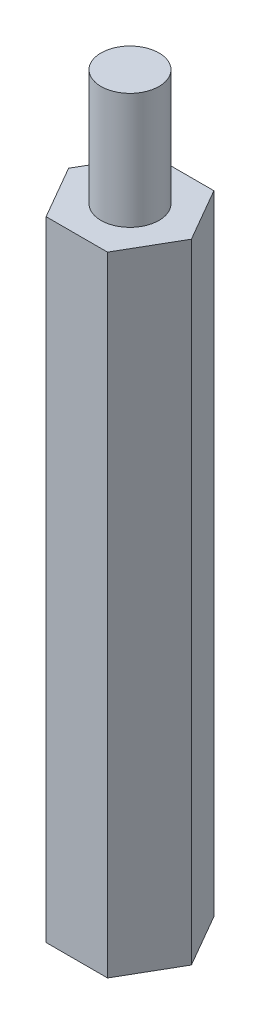
ISO-10303-21;
HEADER;
FILE_DESCRIPTION(('STEP AP214'),'2;1');
FILE_NAME('part.step','',(''),(''),'','','');
FILE_SCHEMA(('AUTOMOTIVE_DESIGN { 1 0 10303 214 1 1 1 1 }'));
ENDSEC;
DATA;
#1=APPLICATION_CONTEXT('core data for automotive mechanical design processes');
#2=APPLICATION_PROTOCOL_DEFINITION('international standard','automotive_design',2000,#1);
#3=PRODUCT_CONTEXT('',#1,'mechanical');
#4=PRODUCT('Part','Part','',(#3));
#5=PRODUCT_RELATED_PRODUCT_CATEGORY('part','',(#4));
#6=PRODUCT_DEFINITION_FORMATION('','',#4);
#7=PRODUCT_DEFINITION_CONTEXT('part definition',#1,'design');
#8=PRODUCT_DEFINITION('design','',#6,#7);
#9=PRODUCT_DEFINITION_SHAPE('','',#8);
#10=(LENGTH_UNIT() NAMED_UNIT(*) SI_UNIT(.MILLI.,.METRE.));
#11=(NAMED_UNIT(*) PLANE_ANGLE_UNIT() SI_UNIT($,.RADIAN.));
#12=(NAMED_UNIT(*) SI_UNIT($,.STERADIAN.) SOLID_ANGLE_UNIT());
#13=UNCERTAINTY_MEASURE_WITH_UNIT(LENGTH_MEASURE(1.E-05),#10,'distance_accuracy_value','');
#14=(GEOMETRIC_REPRESENTATION_CONTEXT(3) GLOBAL_UNCERTAINTY_ASSIGNED_CONTEXT((#13)) GLOBAL_UNIT_ASSIGNED_CONTEXT((#10,
#11,#12)) REPRESENTATION_CONTEXT('',''));
#15=CARTESIAN_POINT('',(0.,0.,0.));
#16=DIRECTION('',(0.,0.,1.));
#17=DIRECTION('',(1.,0.,0.));
#18=AXIS2_PLACEMENT_3D('',#15,#16,#17);
#19=CARTESIAN_POINT('',(-1.58771324027147,32.5,2.75));
#20=DIRECTION('',(0.,0.,-1.));
#21=DIRECTION('',(-1.,0.,0.));
#22=AXIS2_PLACEMENT_3D('',#19,#20,#21);
#23=PLANE('',#22);
#24=DIRECTION('',(1.,0.,0.));
#25=VECTOR('',#24,1.);
#26=CARTESIAN_POINT('',(-1.58771324027147,0.,2.75));
#27=LINE('',#26,#25);
#28=CARTESIAN_POINT('',(-1.58771324027147,0.,2.75));
#29=VERTEX_POINT('',#28);
#30=CARTESIAN_POINT('',(1.58771324027147,0.,2.75));
#31=VERTEX_POINT('',#30);
#32=EDGE_CURVE('E130',#29,#31,#27,.T.);
#33=ORIENTED_EDGE('',*,*,#32,.T.);
#34=DIRECTION('',(0.,-1.,0.));
#35=VECTOR('',#34,1.);
#36=CARTESIAN_POINT('',(1.58771324027147,32.5,2.75));
#37=LINE('',#36,#35);
#38=CARTESIAN_POINT('',(1.58771324027147,32.5,2.75));
#39=VERTEX_POINT('',#38);
#40=EDGE_CURVE('E42',#39,#31,#37,.T.);
#41=ORIENTED_EDGE('',*,*,#40,.F.);
#42=DIRECTION('',(1.,0.,0.));
#43=VECTOR('',#42,1.);
#44=CARTESIAN_POINT('',(-1.58771324027147,32.5,2.75));
#45=LINE('',#44,#43);
#46=CARTESIAN_POINT('',(-1.58771324027147,32.5,2.75));
#47=VERTEX_POINT('',#46);
#48=EDGE_CURVE('E147',#47,#39,#45,.T.);
#49=ORIENTED_EDGE('',*,*,#48,.F.);
#50=DIRECTION('',(0.,-1.,0.));
#51=VECTOR('',#50,1.);
#52=CARTESIAN_POINT('',(-1.58771324027147,32.5,2.75));
#53=LINE('',#52,#51);
#54=EDGE_CURVE('E126',#47,#29,#53,.T.);
#55=ORIENTED_EDGE('',*,*,#54,.T.);
#56=EDGE_LOOP('',(#33,#41,#49,#55));
#57=FACE_BOUND('',#56,.T.);
#58=ADVANCED_FACE('F39',(#57),#23,.F.);
#59=CARTESIAN_POINT('',(1.58771324027147,32.5,2.75));
#60=DIRECTION('',(-0.866025403784439,0.,-0.5));
#61=DIRECTION('',(-0.5,0.,0.866025403784439));
#62=AXIS2_PLACEMENT_3D('',#59,#60,#61);
#63=PLANE('',#62);
#64=DIRECTION('',(0.5,0.,-0.866025403784439));
#65=VECTOR('',#64,1.);
#66=CARTESIAN_POINT('',(1.58771324027147,0.,2.75));
#67=LINE('',#66,#65);
#68=CARTESIAN_POINT('',(3.17542648054294,0.,0.));
#69=VERTEX_POINT('',#68);
#70=EDGE_CURVE('E134',#31,#69,#67,.T.);
#71=ORIENTED_EDGE('',*,*,#70,.T.);
#72=DIRECTION('',(0.,-1.,0.));
#73=VECTOR('',#72,1.);
#74=CARTESIAN_POINT('',(3.17542648054294,32.5,0.));
#75=LINE('',#74,#73);
#76=CARTESIAN_POINT('',(3.17542648054294,32.5,0.));
#77=VERTEX_POINT('',#76);
#78=EDGE_CURVE('E153',#77,#69,#75,.T.);
#79=ORIENTED_EDGE('',*,*,#78,.F.);
#80=DIRECTION('',(0.5,0.,-0.866025403784439));
#81=VECTOR('',#80,1.);
#82=CARTESIAN_POINT('',(1.58771324027147,32.5,2.75));
#83=LINE('',#82,#81);
#84=EDGE_CURVE('E95',#39,#77,#83,.T.);
#85=ORIENTED_EDGE('',*,*,#84,.F.);
#86=ORIENTED_EDGE('',*,*,#40,.T.);
#87=EDGE_LOOP('',(#71,#79,#85,#86));
#88=FACE_BOUND('',#87,.T.);
#89=ADVANCED_FACE('F160',(#88),#63,.F.);
#90=CARTESIAN_POINT('',(3.17542648054294,32.5,0.));
#91=DIRECTION('',(-0.866025403784438,0.,0.5));
#92=DIRECTION('',(0.5,0.,0.866025403784438));
#93=AXIS2_PLACEMENT_3D('',#90,#91,#92);
#94=PLANE('',#93);
#95=DIRECTION('',(-0.5,0.,-0.866025403784438));
#96=VECTOR('',#95,1.);
#97=CARTESIAN_POINT('',(3.17542648054294,0.,0.));
#98=LINE('',#97,#96);
#99=CARTESIAN_POINT('',(1.58771324027147,0.,-2.75));
#100=VERTEX_POINT('',#99);
#101=EDGE_CURVE('E138',#69,#100,#98,.T.);
#102=ORIENTED_EDGE('',*,*,#101,.T.);
#103=DIRECTION('',(0.,-1.,0.));
#104=VECTOR('',#103,1.);
#105=CARTESIAN_POINT('',(1.58771324027147,32.5,-2.75));
#106=LINE('',#105,#104);
#107=CARTESIAN_POINT('',(1.58771324027147,32.5,-2.75));
#108=VERTEX_POINT('',#107);
#109=EDGE_CURVE('E119',#108,#100,#106,.T.);
#110=ORIENTED_EDGE('',*,*,#109,.F.);
#111=DIRECTION('',(-0.5,0.,-0.866025403784438));
#112=VECTOR('',#111,1.);
#113=CARTESIAN_POINT('',(3.17542648054294,32.5,0.));
#114=LINE('',#113,#112);
#115=EDGE_CURVE('E108',#77,#108,#114,.T.);
#116=ORIENTED_EDGE('',*,*,#115,.F.);
#117=ORIENTED_EDGE('',*,*,#78,.T.);
#118=EDGE_LOOP('',(#102,#110,#116,#117));
#119=FACE_BOUND('',#118,.T.);
#120=ADVANCED_FACE('F166',(#119),#94,.F.);
#121=CARTESIAN_POINT('',(1.58771324027147,32.5,-2.75));
#122=DIRECTION('',(0.,0.,1.));
#123=DIRECTION('',(1.,0.,0.));
#124=AXIS2_PLACEMENT_3D('',#121,#122,#123);
#125=PLANE('',#124);
#126=DIRECTION('',(-1.,0.,0.));
#127=VECTOR('',#126,1.);
#128=CARTESIAN_POINT('',(1.58771324027147,0.,-2.75));
#129=LINE('',#128,#127);
#130=CARTESIAN_POINT('',(-1.58771324027147,0.,-2.75));
#131=VERTEX_POINT('',#130);
#132=EDGE_CURVE('E117',#100,#131,#129,.T.);
#133=ORIENTED_EDGE('',*,*,#132,.T.);
#134=DIRECTION('',(0.,-1.,0.));
#135=VECTOR('',#134,1.);
#136=CARTESIAN_POINT('',(-1.58771324027147,32.5,-2.75));
#137=LINE('',#136,#135);
#138=CARTESIAN_POINT('',(-1.58771324027147,32.5,-2.75));
#139=VERTEX_POINT('',#138);
#140=EDGE_CURVE('E114',#139,#131,#137,.T.);
#141=ORIENTED_EDGE('',*,*,#140,.F.);
#142=DIRECTION('',(-1.,0.,0.));
#143=VECTOR('',#142,1.);
#144=CARTESIAN_POINT('',(1.58771324027147,32.5,-2.75));
#145=LINE('',#144,#143);
#146=EDGE_CURVE('E102',#108,#139,#145,.T.);
#147=ORIENTED_EDGE('',*,*,#146,.F.);
#148=ORIENTED_EDGE('',*,*,#109,.T.);
#149=EDGE_LOOP('',(#133,#141,#147,#148));
#150=FACE_BOUND('',#149,.T.);
#151=ADVANCED_FACE('F115',(#150),#125,.F.);
#152=CARTESIAN_POINT('',(-1.58771324027147,32.5,-2.75));
#153=DIRECTION('',(0.866025403784439,0.,0.5));
#154=DIRECTION('',(0.5,0.,-0.866025403784439));
#155=AXIS2_PLACEMENT_3D('',#152,#153,#154);
#156=PLANE('',#155);
#157=DIRECTION('',(-0.5,0.,0.866025403784439));
#158=VECTOR('',#157,1.);
#159=CARTESIAN_POINT('',(-1.58771324027147,0.,-2.75));
#160=LINE('',#159,#158);
#161=CARTESIAN_POINT('',(-3.17542648054294,0.,0.));
#162=VERTEX_POINT('',#161);
#163=EDGE_CURVE('E80',#131,#162,#160,.T.);
#164=ORIENTED_EDGE('',*,*,#163,.T.);
#165=DIRECTION('',(0.,-1.,0.));
#166=VECTOR('',#165,1.);
#167=CARTESIAN_POINT('',(-3.17542648054294,32.5,0.));
#168=LINE('',#167,#166);
#169=CARTESIAN_POINT('',(-3.17542648054294,32.5,0.));
#170=VERTEX_POINT('',#169);
#171=EDGE_CURVE('E120',#170,#162,#168,.T.);
#172=ORIENTED_EDGE('',*,*,#171,.F.);
#173=DIRECTION('',(-0.5,0.,0.866025403784439));
#174=VECTOR('',#173,1.);
#175=CARTESIAN_POINT('',(-1.58771324027147,32.5,-2.75));
#176=LINE('',#175,#174);
#177=EDGE_CURVE('E106',#139,#170,#176,.T.);
#178=ORIENTED_EDGE('',*,*,#177,.F.);
#179=ORIENTED_EDGE('',*,*,#140,.T.);
#180=EDGE_LOOP('',(#164,#172,#178,#179));
#181=FACE_BOUND('',#180,.T.);
#182=ADVANCED_FACE('F122',(#181),#156,.F.);
#183=CARTESIAN_POINT('',(-3.17542648054294,32.5,0.));
#184=DIRECTION('',(0.866025403784438,0.,-0.5));
#185=DIRECTION('',(-0.5,0.,-0.866025403784439));
#186=AXIS2_PLACEMENT_3D('',#183,#184,#185);
#187=PLANE('',#186);
#188=DIRECTION('',(0.5,0.,0.866025403784439));
#189=VECTOR('',#188,1.);
#190=CARTESIAN_POINT('',(-3.17542648054294,0.,0.));
#191=LINE('',#190,#189);
#192=EDGE_CURVE('E86',#162,#29,#191,.T.);
#193=ORIENTED_EDGE('',*,*,#192,.T.);
#194=ORIENTED_EDGE('',*,*,#54,.F.);
#195=DIRECTION('',(0.5,0.,0.866025403784439));
#196=VECTOR('',#195,1.);
#197=CARTESIAN_POINT('',(-3.17542648054294,32.5,0.));
#198=LINE('',#197,#196);
#199=EDGE_CURVE('E57',#170,#47,#198,.T.);
#200=ORIENTED_EDGE('',*,*,#199,.F.);
#201=ORIENTED_EDGE('',*,*,#171,.T.);
#202=EDGE_LOOP('',(#193,#194,#200,#201));
#203=FACE_BOUND('',#202,.T.);
#204=ADVANCED_FACE('F195',(#203),#187,.F.);
#205=CARTESIAN_POINT('',(0.,32.5,0.));
#206=DIRECTION('',(0.,1.,0.));
#207=DIRECTION('',(0.,0.,1.));
#208=AXIS2_PLACEMENT_3D('',#205,#206,#207);
#209=PLANE('',#208);
#210=CARTESIAN_POINT('',(0.,32.5,0.));
#211=DIRECTION('',(0.,1.,0.));
#212=DIRECTION('',(0.,0.,1.));
#213=AXIS2_PLACEMENT_3D('',#210,#211,#212);
#214=CIRCLE('',#213,1.5);
#215=CARTESIAN_POINT('',(0.,32.5,1.5));
#216=VERTEX_POINT('',#215);
#217=EDGE_CURVE('E11',#216,#216,#214,.T.);
#218=ORIENTED_EDGE('',*,*,#217,.F.);
#219=EDGE_LOOP('',(#218));
#220=FACE_BOUND('',#219,.T.);
#221=ORIENTED_EDGE('',*,*,#48,.T.);
#222=ORIENTED_EDGE('',*,*,#84,.T.);
#223=ORIENTED_EDGE('',*,*,#115,.T.);
#224=ORIENTED_EDGE('',*,*,#146,.T.);
#225=ORIENTED_EDGE('',*,*,#177,.T.);
#226=ORIENTED_EDGE('',*,*,#199,.T.);
#227=EDGE_LOOP('',(#221,#222,#223,#224,#225,#226));
#228=FACE_BOUND('',#227,.T.);
#229=ADVANCED_FACE('F104',(#220,#228),#209,.T.);
#230=CARTESIAN_POINT('',(0.,0.,0.));
#231=DIRECTION('',(0.,1.,0.));
#232=DIRECTION('',(0.,0.,1.));
#233=AXIS2_PLACEMENT_3D('',#230,#231,#232);
#234=PLANE('',#233);
#235=CARTESIAN_POINT('',(0.,0.,0.));
#236=DIRECTION('',(0.,-1.,0.));
#237=DIRECTION('',(0.,0.,-1.));
#238=AXIS2_PLACEMENT_3D('',#235,#236,#237);
#239=CIRCLE('',#238,1.5);
#240=CARTESIAN_POINT('',(0.,0.,-1.5));
#241=VERTEX_POINT('',#240);
#242=EDGE_CURVE('E173',#241,#241,#239,.T.);
#243=ORIENTED_EDGE('',*,*,#242,.F.);
#244=EDGE_LOOP('',(#243));
#245=FACE_BOUND('',#244,.T.);
#246=ORIENTED_EDGE('',*,*,#32,.F.);
#247=ORIENTED_EDGE('',*,*,#192,.F.);
#248=ORIENTED_EDGE('',*,*,#163,.F.);
#249=ORIENTED_EDGE('',*,*,#132,.F.);
#250=ORIENTED_EDGE('',*,*,#101,.F.);
#251=ORIENTED_EDGE('',*,*,#70,.F.);
#252=EDGE_LOOP('',(#246,#247,#248,#249,#250,#251));
#253=FACE_BOUND('',#252,.T.);
#254=ADVANCED_FACE('F165',(#245,#253),#234,.F.);
#255=CARTESIAN_POINT('',(0.,6.,0.));
#256=DIRECTION('',(0.,-1.,0.));
#257=DIRECTION('',(0.,0.,-1.));
#258=AXIS2_PLACEMENT_3D('',#255,#256,#257);
#259=CYLINDRICAL_SURFACE('',#258,1.5);
#260=CARTESIAN_POINT('',(0.,6.,0.));
#261=DIRECTION('',(0.,-1.,0.));
#262=DIRECTION('',(0.,0.,-1.));
#263=AXIS2_PLACEMENT_3D('',#260,#261,#262);
#264=CIRCLE('',#263,1.5);
#265=CARTESIAN_POINT('',(0.,6.,-1.5));
#266=VERTEX_POINT('',#265);
#267=EDGE_CURVE('E135',#266,#266,#264,.T.);
#268=ORIENTED_EDGE('',*,*,#267,.F.);
#269=EDGE_LOOP('',(#268));
#270=FACE_BOUND('',#269,.T.);
#271=ORIENTED_EDGE('',*,*,#242,.T.);
#272=EDGE_LOOP('',(#271));
#273=FACE_BOUND('',#272,.T.);
#274=ADVANCED_FACE('F201',(#270,#273),#259,.F.);
#275=CARTESIAN_POINT('',(0.,6.,0.));
#276=DIRECTION('',(0.,-1.,0.));
#277=DIRECTION('',(0.,0.,-1.));
#278=AXIS2_PLACEMENT_3D('',#275,#276,#277);
#279=PLANE('',#278);
#280=ORIENTED_EDGE('',*,*,#267,.T.);
#281=EDGE_LOOP('',(#280));
#282=FACE_BOUND('',#281,.T.);
#283=ADVANCED_FACE('F190',(#282),#279,.T.);
#284=CARTESIAN_POINT('',(0.,38.5,0.));
#285=DIRECTION('',(0.,-1.,0.));
#286=DIRECTION('',(0.,0.,-1.));
#287=AXIS2_PLACEMENT_3D('',#284,#285,#286);
#288=CYLINDRICAL_SURFACE('',#287,1.5);
#289=CARTESIAN_POINT('',(0.,38.5,0.));
#290=DIRECTION('',(0.,1.,0.));
#291=DIRECTION('',(0.,0.,1.));
#292=AXIS2_PLACEMENT_3D('',#289,#290,#291);
#293=CIRCLE('',#292,1.5);
#294=CARTESIAN_POINT('',(0.,38.5,1.5));
#295=VERTEX_POINT('',#294);
#296=EDGE_CURVE('E177',#295,#295,#293,.T.);
#297=ORIENTED_EDGE('',*,*,#296,.F.);
#298=EDGE_LOOP('',(#297));
#299=FACE_BOUND('',#298,.T.);
#300=ORIENTED_EDGE('',*,*,#217,.T.);
#301=EDGE_LOOP('',(#300));
#302=FACE_BOUND('',#301,.T.);
#303=ADVANCED_FACE('F187',(#299,#302),#288,.T.);
#304=CARTESIAN_POINT('',(0.,38.5,0.));
#305=DIRECTION('',(0.,1.,0.));
#306=DIRECTION('',(0.,0.,1.));
#307=AXIS2_PLACEMENT_3D('',#304,#305,#306);
#308=PLANE('',#307);
#309=ORIENTED_EDGE('',*,*,#296,.T.);
#310=EDGE_LOOP('',(#309));
#311=FACE_BOUND('',#310,.T.);
#312=ADVANCED_FACE('F185',(#311),#308,.T.);
#313=CLOSED_SHELL('',(#58,#89,#120,#151,#182,#204,#229,#254,#274,#283,#303,#312));
#314=MANIFOLD_SOLID_BREP('B2',#313);
#315=ADVANCED_BREP_SHAPE_REPRESENTATION('',(#18,#314),#14);
#316=SHAPE_DEFINITION_REPRESENTATION(#9,#315);
ENDSEC;
END-ISO-10303-21;
